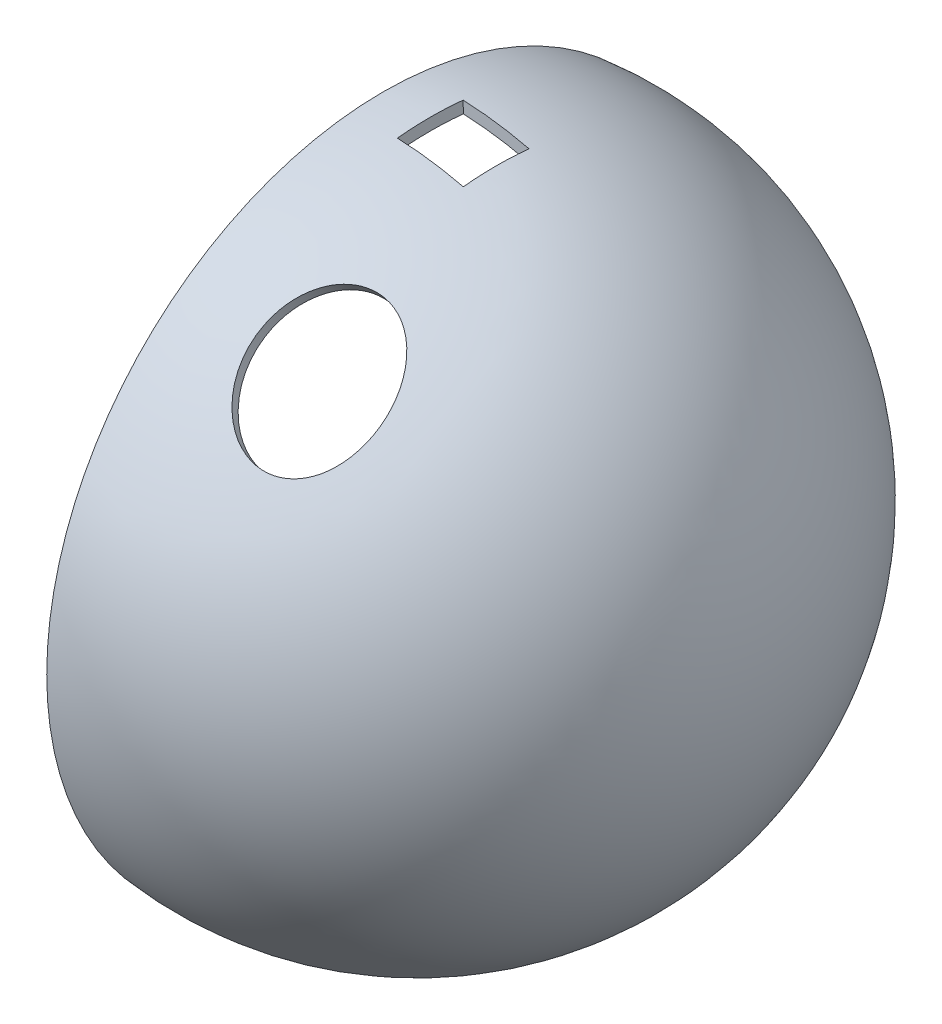
ISO-10303-21;
HEADER;
FILE_DESCRIPTION(('STEP AP214'),'2;1');
FILE_NAME('part.step','',(''),(''),'','','');
FILE_SCHEMA(('AUTOMOTIVE_DESIGN { 1 0 10303 214 1 1 1 1 }'));
ENDSEC;
DATA;
#1=APPLICATION_CONTEXT('core data for automotive mechanical design processes');
#2=APPLICATION_PROTOCOL_DEFINITION('international standard','automotive_design',2000,#1);
#3=PRODUCT_CONTEXT('',#1,'mechanical');
#4=PRODUCT('Part','Part','',(#3));
#5=PRODUCT_RELATED_PRODUCT_CATEGORY('part','',(#4));
#6=PRODUCT_DEFINITION_FORMATION('','',#4);
#7=PRODUCT_DEFINITION_CONTEXT('part definition',#1,'design');
#8=PRODUCT_DEFINITION('design','',#6,#7);
#9=PRODUCT_DEFINITION_SHAPE('','',#8);
#10=(LENGTH_UNIT() NAMED_UNIT(*) SI_UNIT(.MILLI.,.METRE.));
#11=(NAMED_UNIT(*) PLANE_ANGLE_UNIT() SI_UNIT($,.RADIAN.));
#12=(NAMED_UNIT(*) SI_UNIT($,.STERADIAN.) SOLID_ANGLE_UNIT());
#13=UNCERTAINTY_MEASURE_WITH_UNIT(LENGTH_MEASURE(1.E-05),#10,'distance_accuracy_value','');
#14=(GEOMETRIC_REPRESENTATION_CONTEXT(3) GLOBAL_UNCERTAINTY_ASSIGNED_CONTEXT((#13)) GLOBAL_UNIT_ASSIGNED_CONTEXT((#10,
#11,#12)) REPRESENTATION_CONTEXT('',''));
#15=CARTESIAN_POINT('',(0.,0.,0.));
#16=DIRECTION('',(0.,0.,1.));
#17=DIRECTION('',(1.,0.,0.));
#18=AXIS2_PLACEMENT_3D('',#15,#16,#17);
#19=CARTESIAN_POINT('',(-42.8018234911027,330.2,0.));
#20=DIRECTION('',(-1.,0.,0.));
#21=DIRECTION('',(0.,1.,0.));
#22=AXIS2_PLACEMENT_3D('',#19,#20,#21);
#23=SPHERICAL_SURFACE('',#22,228.6);
#24=CARTESIAN_POINT('',(-29.1388080691043,330.485631534092,0.));
#25=DIRECTION('',(0.999781552605937,0.0209008867960507,0.));
#26=DIRECTION('',(-0.0209008867960507,0.999781552605937,0.));
#27=AXIS2_PLACEMENT_3D('',#24,#25,#26);
#28=CIRCLE('',#27,228.191148873494);
#29=CARTESIAN_POINT('',(-24.3920860006964,103.428990079123,22.225));
#30=VERTEX_POINT('',#29);
#31=CARTESIAN_POINT('',(-24.3920860006964,103.428990079123,-22.225));
#32=VERTEX_POINT('',#31);
#33=EDGE_CURVE('E117',#30,#32,#28,.T.);
#34=ORIENTED_EDGE('',*,*,#33,.F.);
#35=CARTESIAN_POINT('',(-42.8018234911027,330.2,22.225));
#36=DIRECTION('',(0.,0.,-1.));
#37=DIRECTION('',(-1.,0.,0.));
#38=AXIS2_PLACEMENT_3D('',#35,#36,#37);
#39=CIRCLE('',#38,227.517052932302);
#40=CARTESIAN_POINT('',(19.8990376099266,111.493321107495,22.225));
#41=VERTEX_POINT('',#40);
#42=EDGE_CURVE('E104',#41,#30,#39,.T.);
#43=ORIENTED_EDGE('',*,*,#42,.F.);
#44=CARTESIAN_POINT('',(15.3014819442296,331.414675952177,0.));
#45=DIRECTION('',(-0.999781552605937,-0.0209008867960507,0.));
#46=DIRECTION('',(0.0209008867960507,-0.999781552605937,0.));
#47=AXIS2_PLACEMENT_3D('',#44,#45,#46);
#48=CIRCLE('',#47,221.089326879024);
#49=CARTESIAN_POINT('',(19.8990376099266,111.493321107495,-22.225));
#50=VERTEX_POINT('',#49);
#51=EDGE_CURVE('E253',#50,#41,#48,.T.);
#52=ORIENTED_EDGE('',*,*,#51,.F.);
#53=CARTESIAN_POINT('',(-42.8018234911027,330.2,-22.225));
#54=DIRECTION('',(0.,0.,1.));
#55=DIRECTION('',(1.,0.,0.));
#56=AXIS2_PLACEMENT_3D('',#53,#54,#55);
#57=CIRCLE('',#56,227.517052932302);
#58=EDGE_CURVE('E128',#32,#50,#57,.T.);
#59=ORIENTED_EDGE('',*,*,#58,.F.);
#60=EDGE_LOOP('',(#34,#43,#52,#59));
#61=FACE_BOUND('',#60,.T.);
#62=CARTESIAN_POINT('',(-65.6618234911027,330.2,0.));
#63=DIRECTION('',(-1.,0.,0.));
#64=DIRECTION('',(0.,0.,1.));
#65=AXIS2_PLACEMENT_3D('',#62,#63,#64);
#66=CIRCLE('',#65,227.454128122573);
#67=CARTESIAN_POINT('',(-65.6618234911027,330.2,227.454128122573));
#68=VERTEX_POINT('',#67);
#69=EDGE_CURVE('E279',#68,#68,#66,.T.);
#70=ORIENTED_EDGE('',*,*,#69,.F.);
#71=EDGE_LOOP('',(#70));
#72=FACE_BOUND('',#71,.T.);
#73=CARTESIAN_POINT('',(21.5548105527977,529.542640197618,91.5352142816228));
#74=CARTESIAN_POINT('',(20.9946202417218,529.666503588726,91.6593269395987));
#75=CARTESIAN_POINT('',(20.4355052571206,529.780707015209,91.798072908496));
#76=CARTESIAN_POINT('',(19.3212284247449,529.989511082851,92.1041942239797));
#77=CARTESIAN_POINT('',(18.7660683536586,530.084103391709,92.2715816847542));
#78=CARTESIAN_POINT('',(17.6617486770059,530.253477936403,92.6340505512017));
#79=CARTESIAN_POINT('',(17.1125896068616,530.328258418202,92.8291344066256));
#80=CARTESIAN_POINT('',(16.0212989977073,530.458075034406,93.2461773032342));
#81=CARTESIAN_POINT('',(15.4791786939356,530.51308263555,93.4681745694117));
#82=CARTESIAN_POINT('',(14.404423312614,530.603318035143,93.9375392029996));
#83=CARTESIAN_POINT('',(13.8717873415052,530.638547706603,94.1849041654104));
#84=CARTESIAN_POINT('',(12.8174491981342,530.689476204086,94.7036025083165));
#85=CARTESIAN_POINT('',(12.2957464256961,530.705176104968,94.9749345688553));
#86=CARTESIAN_POINT('',(11.0108913008253,530.720383868687,95.6791330498014));
#87=CARTESIAN_POINT('',(10.2551169585503,530.708138171573,96.1258389525206));
#88=CARTESIAN_POINT('',(8.77411521014697,530.642413454036,97.0643671961528));
#89=CARTESIAN_POINT('',(8.04888960930047,530.588932000375,97.5561921979423));
#90=CARTESIAN_POINT('',(6.63194937066435,530.442554703632,98.5796631091349));
#91=CARTESIAN_POINT('',(5.94021574999728,530.349681485756,99.1112860159401));
#92=CARTESIAN_POINT('',(4.59183419504404,530.126493398663,100.209616214898));
#93=CARTESIAN_POINT('',(3.93518172141706,529.99618338758,100.776318947295));
#94=CARTESIAN_POINT('',(2.42247702917198,529.645491036098,102.155067974572));
#95=CARTESIAN_POINT('',(1.58217648059559,529.409613440779,102.980531883407));
#96=CARTESIAN_POINT('',(-0.0282465899264927,528.876771883281,104.677410818609));
#97=CARTESIAN_POINT('',(-0.798411036548808,528.579844764637,105.548797895446));
#98=CARTESIAN_POINT('',(-2.26814890595555,527.929996351613,107.327840172517));
#99=CARTESIAN_POINT('',(-2.96778356930965,527.577124330957,108.235462936555));
#100=CARTESIAN_POINT('',(-4.29764967032336,526.819701770751,110.079596758121));
#101=CARTESIAN_POINT('',(-4.92786987008846,526.415142886158,111.016112461964));
#102=CARTESIAN_POINT('',(-6.11913923755177,525.558905141313,112.910019691168));
#103=CARTESIAN_POINT('',(-6.6802424403171,525.107263606509,113.867394211207));
#104=CARTESIAN_POINT('',(-7.73488070298338,524.160433610419,115.797466259074));
#105=CARTESIAN_POINT('',(-8.22842109932586,523.66524859349,116.770162569936));
#106=CARTESIAN_POINT('',(-9.14891571454892,522.635010470154,118.725061704198));
#107=CARTESIAN_POINT('',(-9.57590472415743,522.099978412038,119.707259273517));
#108=CARTESIAN_POINT('',(-10.3647954352752,520.992923985713,121.676998434174));
#109=CARTESIAN_POINT('',(-10.7266873785764,520.420896089181,122.664540803894));
#110=CARTESIAN_POINT('',(-11.5305582197867,518.985331361164,125.072467885205));
#111=CARTESIAN_POINT('',(-11.9384765213412,518.103599244226,126.493508602835));
#112=CARTESIAN_POINT('',(-12.6248189076984,516.277516593958,129.326819908158));
#113=CARTESIAN_POINT('',(-12.9032069045649,515.333148693544,130.73908794373));
#114=CARTESIAN_POINT('',(-13.3323560978456,513.389666951064,133.544044475549));
#115=CARTESIAN_POINT('',(-13.4831852443193,512.390582558649,134.936743007057));
#116=CARTESIAN_POINT('',(-13.6588098870947,510.344177136663,137.694137817934));
#117=CARTESIAN_POINT('',(-13.6836152044248,509.296859872297,139.058836271092));
#118=CARTESIAN_POINT('',(-13.607846187253,507.160681317219,141.751698384812));
#119=CARTESIAN_POINT('',(-13.5072748219729,506.071821010939,143.079862909825));
#120=CARTESIAN_POINT('',(-13.18063165111,503.859369413118,145.691192497397));
#121=CARTESIAN_POINT('',(-12.9545563253365,502.735777148233,146.974356296683));
#122=CARTESIAN_POINT('',(-12.3787522816756,500.471698713824,149.475236477571));
#123=CARTESIAN_POINT('',(-12.0301864526649,499.331464877016,150.693448375977));
#124=CARTESIAN_POINT('',(-11.2075939290852,497.031842569342,153.067962492728));
#125=CARTESIAN_POINT('',(-10.733575139438,495.872455309667,154.224268606304));
#126=CARTESIAN_POINT('',(-9.7030005282225,493.640551429924,156.371516498688));
#127=CARTESIAN_POINT('',(-9.15663315922622,492.568859127894,157.368205576618));
#128=CARTESIAN_POINT('',(-7.95501590162527,490.424593576083,159.292733747253));
#129=CARTESIAN_POINT('',(-7.29977967099581,489.352020453577,160.220581455251));
#130=CARTESIAN_POINT('',(-5.95442241809188,487.329243444605,161.902977984218));
#131=CARTESIAN_POINT('',(-5.27548461363342,486.378194630371,162.665454180059));
#132=CARTESIAN_POINT('',(-3.82803094687366,484.490458276333,164.120080161623));
#133=CARTESIAN_POINT('',(-3.0595275748188,483.553768754638,164.81223972812));
#134=CARTESIAN_POINT('',(-1.52780873253299,481.812526261579,166.040874162408));
#135=CARTESIAN_POINT('',(-0.774562439680618,481.005369563256,166.586086627282));
#136=CARTESIAN_POINT('',(0.802168191068511,479.416748808581,167.608253604799));
#137=CARTESIAN_POINT('',(1.62564130798861,478.635280675203,168.085218989602));
#138=CARTESIAN_POINT('',(3.24277822357058,477.194771406073,168.912925763024));
#139=CARTESIAN_POINT('',(4.0289203500727,476.532007448135,169.271881107052));
#140=CARTESIAN_POINT('',(5.65387555440074,475.239913100232,169.925314810061));
#141=CARTESIAN_POINT('',(6.49268397141448,474.61057976083,170.219798864243));
#142=CARTESIAN_POINT('',(8.13114685750253,473.455603360276,170.711971916634));
#143=CARTESIAN_POINT('',(8.92592117943557,472.925959538333,170.916510426621));
#144=CARTESIAN_POINT('',(10.5525063814183,471.905465130558,171.265257455205));
#145=CARTESIAN_POINT('',(11.3843047568827,471.414601600098,171.409486174443));
#146=CARTESIAN_POINT('',(13.0103268642653,470.516624163651,171.624614594442));
#147=CARTESIAN_POINT('',(13.801888437653,470.105939584906,171.70063173518));
#148=CARTESIAN_POINT('',(15.0072215770065,469.521459729642,171.772540012722));
#149=CARTESIAN_POINT('',(15.4121884797294,469.331810853086,171.789487954491));
#150=CARTESIAN_POINT('',(16.2275653425286,468.963587665954,171.809074978715));
#151=CARTESIAN_POINT('',(16.6379763846731,468.785015598267,171.811711172544));
#152=CARTESIAN_POINT('',(17.8396684046613,468.282144476339,171.798201072582));
#153=CARTESIAN_POINT('',(18.637353147722,467.973269264142,171.762758671345));
#154=CARTESIAN_POINT('',(20.2451188805164,467.401637520903,171.637658935632));
#155=CARTESIAN_POINT('',(21.0552034758264,467.138894692041,171.547985528564));
#156=CARTESIAN_POINT('',(22.6825227134219,466.662379560437,171.314074815565));
#157=CARTESIAN_POINT('',(23.4997617227594,466.448639699942,171.16980152852));
#158=CARTESIAN_POINT('',(25.1346916013557,466.07256422288,170.82730781866));
#159=CARTESIAN_POINT('',(25.9523824239694,465.910224036788,170.629092194332));
#160=CARTESIAN_POINT('',(27.5706846846263,465.640083549721,170.183331676805));
#161=CARTESIAN_POINT('',(28.3713750747833,465.531552441033,169.936515220695));
#162=CARTESIAN_POINT('',(29.9614454187845,465.365936733045,169.394063538758));
#163=CARTESIAN_POINT('',(30.7508252196847,465.30885282878,169.09842765346));
#164=CARTESIAN_POINT('',(32.3129146104614,465.245496735437,168.46116043423));
#165=CARTESIAN_POINT('',(33.0856227179647,465.239229046294,168.11952502962));
#166=CARTESIAN_POINT('',(34.6094722193833,465.276063365791,167.393611123152));
#167=CARTESIAN_POINT('',(35.3606134933848,465.319165648879,167.009332384251));
#168=CARTESIAN_POINT('',(36.8455893469166,465.453375165867,166.197181003512));
#169=CARTESIAN_POINT('',(37.5791313426492,465.545020866666,165.768863695197));
#170=CARTESIAN_POINT('',(39.0165204869468,465.773929174886,164.876187641378));
#171=CARTESIAN_POINT('',(39.7203663404911,465.911193769391,164.411827326575));
#172=CARTESIAN_POINT('',(41.0954624591711,466.228248467451,163.451061109121));
#173=CARTESIAN_POINT('',(41.7667227826307,466.408025346644,162.954665206673));
#174=CARTESIAN_POINT('',(43.0748254394758,466.80687524626,161.933477769051));
#175=CARTESIAN_POINT('',(43.7116713511096,467.025944171012,161.408689197412));
#176=CARTESIAN_POINT('',(45.2002910125453,467.596154991784,160.116583871252));
#177=CARTESIAN_POINT('',(46.0347951782089,467.964875238661,159.337034751909));
#178=CARTESIAN_POINT('',(47.6311679117266,468.764661103693,157.737458465733));
#179=CARTESIAN_POINT('',(48.3930494417019,469.195715561366,156.917438562172));
#180=CARTESIAN_POINT('',(49.8503735686587,470.116217774277,155.236735539446));
#181=CARTESIAN_POINT('',(50.5451666096637,470.606149754536,154.375756156152));
#182=CARTESIAN_POINT('',(51.8612390319321,471.633999676336,152.626182407178));
#183=CARTESIAN_POINT('',(52.4824857444384,472.171938757605,151.737575989396));
#184=CARTESIAN_POINT('',(53.6527929169591,473.289584497154,149.937667202003));
#185=CARTESIAN_POINT('',(54.2017704803519,473.869337959501,149.026340170879));
#186=CARTESIAN_POINT('',(55.2278699181016,475.064013776238,147.18703182583));
#187=CARTESIAN_POINT('',(55.7050106576108,475.678926838592,146.259054956233));
#188=CARTESIAN_POINT('',(56.6569085174574,477.035670307764,144.246857799292));
#189=CARTESIAN_POINT('',(57.1200636178336,477.78249644,143.160513862202));
#190=CARTESIAN_POINT('',(57.9545694668635,479.308640523629,140.977546168879));
#191=CARTESIAN_POINT('',(58.3260175385219,480.087922995383,139.880934603448));
#192=CARTESIAN_POINT('',(58.9796643206205,481.67386292491,137.681163414463));
#193=CARTESIAN_POINT('',(59.2618705288428,482.480518076619,136.578004348943));
#194=CARTESIAN_POINT('',(59.7387495369816,484.116445417751,134.369137087808));
#195=CARTESIAN_POINT('',(59.9333985585329,484.945723686277,133.263428281592));
#196=CARTESIAN_POINT('',(60.2362556292249,486.622003727707,131.05424789963));
#197=CARTESIAN_POINT('',(60.3444927093304,487.468999450033,129.950775696854));
#198=CARTESIAN_POINT('',(60.4754939111179,489.177021744536,127.749782255371));
#199=CARTESIAN_POINT('',(60.4982640266183,490.038047328541,126.652260604742));
#200=CARTESIAN_POINT('',(60.4588112413192,491.77064503855,124.467154204978));
#201=CARTESIAN_POINT('',(60.3965899961868,492.642216958779,123.379569262686));
#202=CARTESIAN_POINT('',(60.1872152971887,494.392678134437,121.218508880927));
#203=CARTESIAN_POINT('',(60.0400603906052,495.271567514772,120.145033683115));
#204=CARTESIAN_POINT('',(59.6604557933947,497.033655857036,118.016599006031));
#205=CARTESIAN_POINT('',(59.4279955323465,497.916855339652,116.961641838362));
#206=CARTESIAN_POINT('',(58.8770606083453,499.684404787534,114.875350376806));
#207=CARTESIAN_POINT('',(58.5585858212166,500.568754754457,113.844016117026));
#208=CARTESIAN_POINT('',(57.8344175259651,502.335798497413,111.810197798105));
#209=CARTESIAN_POINT('',(57.428693416374,503.218491582465,110.807724001603));
#210=CARTESIAN_POINT('',(56.5287112442733,504.978587339066,108.838397204421));
#211=CARTESIAN_POINT('',(56.0344543139379,505.855990078121,107.871543748413));
#212=CARTESIAN_POINT('',(54.9554733627425,507.602383059847,105.980254375186));
#213=CARTESIAN_POINT('',(54.370694611958,508.471367873012,105.055844560926));
#214=CARTESIAN_POINT('',(53.1091251886683,510.196283252552,103.258593277791));
#215=CARTESIAN_POINT('',(52.432326423141,511.052212663351,102.385756354371));
#216=CARTESIAN_POINT('',(51.0226952598422,512.702141237436,100.745429063427));
#217=CARTESIAN_POINT('',(50.2945666516693,513.497054844173,99.9748255348134));
#218=CARTESIAN_POINT('',(48.753758980783,515.065134813965,98.4995836893178));
#219=CARTESIAN_POINT('',(47.9411274338128,515.838313091323,97.7949087199862));
#220=CARTESIAN_POINT('',(46.34978696498,517.25177748136,96.5550762549574));
#221=CARTESIAN_POINT('',(45.5819947389088,517.895626424317,96.0099614624017));
#222=CARTESIAN_POINT('',(43.983131073143,519.159280518289,94.9843371808277));
#223=CARTESIAN_POINT('',(43.1519710809411,519.779050125438,94.5039207949349));
#224=CARTESIAN_POINT('',(41.7760661193181,520.744830490302,93.7959198203131));
#225=CARTESIAN_POINT('',(41.2504735129944,521.100751273673,93.5443244236502));
#226=CARTESIAN_POINT('',(40.178381231646,521.800472661929,93.0697078852254));
#227=CARTESIAN_POINT('',(39.6318754183986,522.144269650582,92.8466952176026));
#228=CARTESIAN_POINT('',(38.5189833480514,522.81828569559,92.4313198643039));
#229=CARTESIAN_POINT('',(37.9525924667444,523.148501554409,92.2389643662384));
#230=CARTESIAN_POINT('',(36.8021410052326,523.793323279883,91.8872083334245));
#231=CARTESIAN_POINT('',(36.2181077669515,524.107951488312,91.7277595301277));
#232=CARTESIAN_POINT('',(35.0332655797849,524.720514003242,91.4433893823302));
#233=CARTESIAN_POINT('',(34.4324601412235,525.018451764286,91.3184608717058));
#234=CARTESIAN_POINT('',(33.2161665408084,525.595973554664,91.1049008187498));
#235=CARTESIAN_POINT('',(32.6006878437507,525.875569000907,91.0162465145756));
#236=CARTESIAN_POINT('',(31.5659440405881,526.324377594987,90.9001016480395));
#237=CARTESIAN_POINT('',(31.1502231452563,526.499118659956,90.86206888083));
#238=CARTESIAN_POINT('',(30.31392181235,526.839434538446,90.8030020170222));
#239=CARTESIAN_POINT('',(29.8933423090214,527.005011079855,90.7819647058434));
#240=CARTESIAN_POINT('',(29.048318398089,527.326488501272,90.7571981842697));
#241=CARTESIAN_POINT('',(28.6238767605178,527.482395772026,90.753457419094));
#242=CARTESIAN_POINT('',(27.7716400518744,527.78426121776,90.763485810313));
#243=CARTESIAN_POINT('',(27.3438447578574,527.930218724936,90.7772561407927));
#244=CARTESIAN_POINT('',(26.470916454704,528.216676803714,90.8232460090248));
#245=CARTESIAN_POINT('',(26.0256963997444,528.356812944672,90.8560884001249));
#246=CARTESIAN_POINT('',(25.1336332681576,528.625633015166,90.9407536360276));
#247=CARTESIAN_POINT('',(24.686790280974,528.75431756615,90.9925754500851));
#248=CARTESIAN_POINT('',(23.792156828129,528.999997923025,91.1152111049267));
#249=CARTESIAN_POINT('',(23.3443659220837,529.116985625108,91.1860379893527));
#250=CARTESIAN_POINT('',(22.4490921239615,529.338912221663,91.3465426082458));
#251=CARTESIAN_POINT('',(22.0016093092715,529.443848754736,91.4362240275075));
#252=CARTESIAN_POINT('',(21.5548105527977,529.542640197618,91.5352142816228));
#253=B_SPLINE_CURVE_WITH_KNOTS('',3,(#73,#74,#75,#76,#77,#78,#79,#80,#81,#82,#83,#84,#85,#86,
#87,#88,#89,#90,#91,#92,#93,#94,#95,#96,#97,#98,#99,#100,#101,#102,#103,#104,#105,#106,#107,
#108,#109,#110,#111,#112,#113,#114,#115,#116,#117,#118,#119,#120,#121,#122,#123,#124,#125,#126,
#127,#128,#129,#130,#131,#132,#133,#134,#135,#136,#137,#138,#139,#140,#141,#142,#143,#144,#145,
#146,#147,#148,#149,#150,#151,#152,#153,#154,#155,#156,#157,#158,#159,#160,#161,#162,#163,#164,
#165,#166,#167,#168,#169,#170,#171,#172,#173,#174,#175,#176,#177,#178,#179,#180,#181,#182,#183,
#184,#185,#186,#187,#188,#189,#190,#191,#192,#193,#194,#195,#196,#197,#198,#199,#200,#201,#202,
#203,#204,#205,#206,#207,#208,#209,#210,#211,#212,#213,#214,#215,#216,#217,#218,#219,#220,#221,
#222,#223,#224,#225,#226,#227,#228,#229,#230,#231,#232,#233,#234,#235,#236,#237,#238,#239,#240,
#241,#242,#243,#244,#245,#246,#247,#248,#249,#250,#251,#252),.UNSPECIFIED.,.T.,.F.,(4,2,2,2,2,2,
2,2,2,2,2,2,2,2,2,2,2,2,2,2,2,2,2,2,2,2,2,2,2,2,2,2,2,2,2,2,2,2,2,2,2,2,2,2,2,2,2,2,2,2,2,2,2,2,
2,2,2,2,2,2,2,2,2,2,2,2,2,2,2,2,2,2,2,2,2,2,2,2,2,2,2,2,2,2,2,2,2,2,2,4),(0.,1.76076665407313,
3.52227989020994,5.28394902968612,7.04815023621904,8.81218434095281,10.5761213543292,
13.2071735635721,15.838381037684,18.4680792833493,21.0974364297534,24.6962857652917,
28.2929695283897,31.8865029165637,35.4806172294011,39.0719036172082,42.6629061837518,
46.2520251579757,49.8416817022913,54.9992345291814,60.1582234227398,65.314462410646,
70.4702995670359,75.6260146230993,80.78187429625,85.8900522927707,90.9979084942682,
95.67952304994,100.360550723723,104.542080108255,108.723027059381,112.413181456552,
116.102747334534,119.366644520861,122.630253267878,125.557366567459,128.483498649507,
131.165294803286,132.507430135661,133.84983634925,136.41502826751,138.980980811542,
141.548627261411,144.116045378648,146.647567501483,149.179123823805,151.710904320935,
154.242698892309,156.803184284273,159.363781221416,161.923582675048,164.483117458457,
168.0780437886,171.672327268642,175.298505536237,178.926288530452,182.558197187568,
186.189150394983,190.377299407883,194.560984505337,198.744318011086,202.928786921809,
207.111849425638,211.294618564819,215.477306223075,219.660065424749,223.843343098734,
228.026626811978,232.21138015295,236.396079982342,240.5833198551,244.770928227814,
248.742108961744,252.711068665311,256.129769778678,259.553339112227,261.600880870033,
263.64902828075,265.697655177958,267.743255386858,269.788430626708,271.832320556186,
273.189586710145,274.546596085846,275.902698794199,277.258892431403,278.662087580058,
280.065206534514,281.469290957697,282.873650040541),.UNSPECIFIED.);
#254=CARTESIAN_POINT('',(21.5548105527977,529.542640197618,91.5352142816228));
#255=VERTEX_POINT('',#254);
#256=EDGE_CURVE('E132',#255,#255,#253,.T.);
#257=ORIENTED_EDGE('',*,*,#256,.F.);
#258=EDGE_LOOP('',(#257));
#259=FACE_BOUND('',#258,.T.);
#260=CARTESIAN_POINT('',(-33.8855301375123,557.542272989061,-22.225));
#261=VERTEX_POINT('',#260);
#262=CARTESIAN_POINT('',(-33.8855301375123,557.542272989061,22.225));
#263=VERTEX_POINT('',#262);
#264=EDGE_CURVE('E126',#261,#263,#28,.T.);
#265=ORIENTED_EDGE('',*,*,#264,.F.);
#266=CARTESIAN_POINT('',(10.7039262785326,551.336030796859,-22.225));
#267=VERTEX_POINT('',#266);
#268=EDGE_CURVE('E134',#267,#261,#57,.T.);
#269=ORIENTED_EDGE('',*,*,#268,.F.);
#270=CARTESIAN_POINT('',(10.7039262785326,551.336030796859,22.225));
#271=VERTEX_POINT('',#270);
#272=EDGE_CURVE('E260',#271,#267,#48,.T.);
#273=ORIENTED_EDGE('',*,*,#272,.F.);
#274=EDGE_CURVE('E115',#263,#271,#39,.T.);
#275=ORIENTED_EDGE('',*,*,#274,.F.);
#276=EDGE_LOOP('',(#265,#269,#273,#275));
#277=FACE_BOUND('',#276,.T.);
#278=ADVANCED_FACE('F41',(#61,#72,#259,#277),#23,.T.);
#279=CARTESIAN_POINT('',(-42.8018234911027,330.2,0.));
#280=DIRECTION('',(-1.,0.,0.));
#281=DIRECTION('',(0.,1.,0.));
#282=AXIS2_PLACEMENT_3D('',#279,#280,#281);
#283=SPHERICAL_SURFACE('',#282,220.6625);
#284=CARTESIAN_POINT('',(-65.6618234911028,330.2,0.));
#285=DIRECTION('',(-1.,0.,0.));
#286=DIRECTION('',(0.,0.,1.));
#287=AXIS2_PLACEMENT_3D('',#284,#285,#286);
#288=CIRCLE('',#287,219.475190639512);
#289=CARTESIAN_POINT('',(-65.6618234911028,330.2,219.475190639512));
#290=VERTEX_POINT('',#289);
#291=EDGE_CURVE('E141',#290,#290,#288,.T.);
#292=ORIENTED_EDGE('',*,*,#291,.T.);
#293=EDGE_LOOP('',(#292));
#294=FACE_BOUND('',#293,.T.);
#295=CARTESIAN_POINT('',(20.6233416279181,523.149935980794,86.2525915024144));
#296=CARTESIAN_POINT('',(20.0629375721465,523.277346032766,86.3796597296597));
#297=CARTESIAN_POINT('',(19.5036860369076,523.395110781448,86.5214307966108));
#298=CARTESIAN_POINT('',(18.3891179428946,523.611099440231,86.8337550018208));
#299=CARTESIAN_POINT('',(17.8338037369788,523.709312483217,87.0043240496161));
#300=CARTESIAN_POINT('',(16.7292347497666,523.885956037858,87.3732758982888));
#301=CARTESIAN_POINT('',(16.1799807289156,523.964384093249,87.5716621478607));
#302=CARTESIAN_POINT('',(15.0882259742785,524.101557633501,87.9955417023308));
#303=CARTESIAN_POINT('',(14.545741499377,524.160262203288,88.22109005341));
#304=CARTESIAN_POINT('',(13.4703507330857,524.257866744313,88.6976542723672));
#305=CARTESIAN_POINT('',(12.9374432151518,524.296769269337,88.9486668512204));
#306=CARTESIAN_POINT('',(11.8826343172056,524.355009959672,89.4747414080309));
#307=CARTESIAN_POINT('',(11.3607322341564,524.37434937842,89.7498018439781));
#308=CARTESIAN_POINT('',(10.0756716006652,524.398567041099,90.4632518868872));
#309=CARTESIAN_POINT('',(9.31992104085943,524.391677027011,90.9155068545776));
#310=CARTESIAN_POINT('',(7.83905656084201,524.336548314726,91.8652033328637));
#311=CARTESIAN_POINT('',(7.1139446920289,524.288306852452,92.3626478621026));
#312=CARTESIAN_POINT('',(5.69740460478247,524.152260622896,93.3973104884119));
#313=CARTESIAN_POINT('',(5.00595274417324,524.064484081926,93.9344999810391));
#314=CARTESIAN_POINT('',(3.65818251536718,523.851305143264,95.0439484128196));
#315=CARTESIAN_POINT('',(3.00185953203645,523.725907702469,95.616202723963));
#316=CARTESIAN_POINT('',(1.48984915401383,523.386564366649,97.0081761712106));
#317=CARTESIAN_POINT('',(0.649938011448027,523.157017999127,97.8413057547118));
#318=CARTESIAN_POINT('',(-0.95966632433594,522.636313276681,99.5534339699723));
#319=CARTESIAN_POINT('',(-1.72939911333224,522.345189976201,100.432406290843));
#320=CARTESIAN_POINT('',(-3.19821219868519,521.706356869733,102.226478284976));
#321=CARTESIAN_POINT('',(-3.8973527902415,521.358696028559,103.141546182514));
#322=CARTESIAN_POINT('',(-5.22611150616035,520.611080646667,105.000335257591));
#323=CARTESIAN_POINT('',(-5.85572164285706,520.211120109258,105.944059711353));
#324=CARTESIAN_POINT('',(-7.0456475433007,519.363420625179,107.852109777841));
#325=CARTESIAN_POINT('',(-7.60602099449204,518.915722040926,108.816417444272));
#326=CARTESIAN_POINT('',(-8.65914845965901,517.976034347049,110.760194541316));
#327=CARTESIAN_POINT('',(-9.15189673839984,517.484041486717,111.739665250064));
#328=CARTESIAN_POINT('',(-10.2359061619152,516.275163717253,114.061811312881));
#329=CARTESIAN_POINT('',(-10.7990490428674,515.540940281529,115.408670618653));
#330=CARTESIAN_POINT('',(-11.8053698863102,514.004697244555,118.108676030103));
#331=CARTESIAN_POINT('',(-12.2485148130199,513.202659053294,119.461823762926));
#332=CARTESIAN_POINT('',(-13.0169091285748,511.538513287266,122.163018926526));
#333=CARTESIAN_POINT('',(-13.342249033154,510.676452440883,123.511069482226));
#334=CARTESIAN_POINT('',(-13.877487970198,508.898195913177,126.194049929264));
#335=CARTESIAN_POINT('',(-14.087395879466,507.982004400543,127.528980821758));
#336=CARTESIAN_POINT('',(-14.3932429016989,506.101675919655,130.17738664788));
#337=CARTESIAN_POINT('',(-14.4892112661971,505.137551323443,131.490867003034));
#338=CARTESIAN_POINT('',(-14.5681643031028,503.166939772041,134.089139567288));
#339=CARTESIAN_POINT('',(-14.5511471379828,502.160452128149,135.373931309473));
#340=CARTESIAN_POINT('',(-14.4044274276808,500.110932897286,137.907439473976));
#341=CARTESIAN_POINT('',(-14.2747248399859,499.067901296528,139.156155882684));
#342=CARTESIAN_POINT('',(-13.9023566052983,496.951272342152,141.610144591079));
#343=CARTESIAN_POINT('',(-13.6596907409082,495.877674929714,142.815416807153));
#344=CARTESIAN_POINT('',(-13.0604729659515,493.705949488648,145.175264357045));
#345=CARTESIAN_POINT('',(-12.7038855458054,492.607813910818,146.329823755769));
#346=CARTESIAN_POINT('',(-11.8754914139298,490.394318555854,148.579752591266));
#347=CARTESIAN_POINT('',(-11.4036860130817,489.27895897482,149.675122701287));
#348=CARTESIAN_POINT('',(-10.3691656336849,487.094015761801,151.745631101954));
#349=CARTESIAN_POINT('',(-9.81205437111326,486.024874669318,152.724032287344));
#350=CARTESIAN_POINT('',(-8.59032066733962,483.886124697932,154.610778537946));
#351=CARTESIAN_POINT('',(-7.92571198309721,482.816515896328,155.519132545494));
#352=CARTESIAN_POINT('',(-6.56549068671841,480.801992154792,157.161760083902));
#353=CARTESIAN_POINT('',(-5.88111245139691,479.856168190639,157.904221804637));
#354=CARTESIAN_POINT('',(-4.42443489480797,477.979163857295,159.318373648195));
#355=CARTESIAN_POINT('',(-3.65214153730219,477.047982499688,159.990068565572));
#356=CARTESIAN_POINT('',(-2.11403859042527,475.316313580398,161.180618205352));
#357=CARTESIAN_POINT('',(-1.35790226783375,474.51321204331,161.708163460009));
#358=CARTESIAN_POINT('',(0.222957597538658,472.933271328758,162.694534338597));
#359=CARTESIAN_POINT('',(1.04764974264914,472.156420355671,163.153391154182));
#360=CARTESIAN_POINT('',(2.66656643125819,470.724032515358,163.947339912447));
#361=CARTESIAN_POINT('',(3.45348047025671,470.064785296879,164.290585682785));
#362=CARTESIAN_POINT('',(4.67264479114174,469.100993412985,164.75715757224));
#363=CARTESIAN_POINT('',(5.08574936442238,468.783732521962,164.904703625471));
#364=CARTESIAN_POINT('',(5.92459807250872,468.158493192632,165.18299548527));
#365=CARTESIAN_POINT('',(6.35034486122588,467.850516731094,165.313737733172));
#366=CARTESIAN_POINT('',(7.56922326920643,466.995780362228,165.658033030634));
#367=CARTESIAN_POINT('',(8.37661838242926,466.460880718044,165.851293648753));
#368=CARTESIAN_POINT('',(10.0288883633886,465.431198392911,166.175666922386));
#369=CARTESIAN_POINT('',(10.8737728950449,464.936426149934,166.306763450433));
#370=CARTESIAN_POINT('',(12.5971172779404,463.99308692622,166.503094540793));
#371=CARTESIAN_POINT('',(13.4755895232211,463.544537231913,166.568304542387));
#372=CARTESIAN_POINT('',(14.8135414545486,462.911411217717,166.614327084856));
#373=CARTESIAN_POINT('',(15.2629443467647,462.706967563159,166.621033976062));
#374=CARTESIAN_POINT('',(16.1677358348709,462.312012185042,166.616895208701));
#375=CARTESIAN_POINT('',(16.6231238829793,462.121499196833,166.606051145513));
#376=CARTESIAN_POINT('',(17.669618970873,461.702863465053,166.56092844281));
#377=CARTESIAN_POINT('',(18.2623986626182,461.479506883379,166.520849201132));
#378=CARTESIAN_POINT('',(19.454267482903,461.058371814142,166.41095845198));
#379=CARTESIAN_POINT('',(20.0533567565061,460.860593916054,166.341146259454));
#380=CARTESIAN_POINT('',(21.2555606018173,460.491825949354,166.171697408256));
#381=CARTESIAN_POINT('',(21.8586751512456,460.320835732601,166.072060914528));
#382=CARTESIAN_POINT('',(23.0660941718707,460.006738603615,165.843205775162));
#383=CARTESIAN_POINT('',(23.6703975372489,459.863612565728,165.714007553798));
#384=CARTESIAN_POINT('',(24.8781411172488,459.605820645341,165.426409021822));
#385=CARTESIAN_POINT('',(25.48158132484,459.491154993356,165.268008474703));
#386=CARTESIAN_POINT('',(26.6849804198703,459.290739469691,164.922727049974));
#387=CARTESIAN_POINT('',(27.2849397602394,459.204985749121,164.735849968105));
#388=CARTESIAN_POINT('',(28.6740951670007,459.039263847648,164.268934755871));
#389=CARTESIAN_POINT('',(29.4611235286203,458.970325111288,163.978400558893));
#390=CARTESIAN_POINT('',(31.0193963770224,458.883157054709,163.351519140309));
#391=CARTESIAN_POINT('',(31.7906423199933,458.864923035013,163.015176167441));
#392=CARTESIAN_POINT('',(33.312761169581,458.877859858093,162.299798366365));
#393=CARTESIAN_POINT('',(34.0636307376393,458.909038747789,161.920756593973));
#394=CARTESIAN_POINT('',(35.5406891715965,459.018850757345,161.123557340685));
#395=CARTESIAN_POINT('',(36.2668769862883,459.097485895719,160.705398196601));
#396=CARTESIAN_POINT('',(37.717523028728,459.303468946291,159.817485776849));
#397=CARTESIAN_POINT('',(38.4409195368162,459.43251434065,159.346394650513));
#398=CARTESIAN_POINT('',(39.8544715065446,459.735786007436,158.370189263954));
#399=CARTESIAN_POINT('',(40.5446251569222,459.910014738417,157.865073153442));
#400=CARTESIAN_POINT('',(41.8893772074329,460.300225917827,156.824842282783));
#401=CARTESIAN_POINT('',(42.5439805659031,460.516202524261,156.289731727344));
#402=CARTESIAN_POINT('',(43.8161193822241,460.986415485049,155.193250529028));
#403=CARTESIAN_POINT('',(44.4336587146406,461.240647830481,154.631882641972));
#404=CARTESIAN_POINT('',(45.8961621160351,461.904436253621,153.232275841545));
#405=CARTESIAN_POINT('',(46.7206905752053,462.332909368322,152.381546323438));
#406=CARTESIAN_POINT('',(48.289004141104,463.252498662378,150.642010174722));
#407=CARTESIAN_POINT('',(49.032835837538,463.743578336181,149.753225932616));
#408=CARTESIAN_POINT('',(50.4399108406035,464.779336758819,147.945592569307));
#409=CARTESIAN_POINT('',(51.1032336773392,465.323961634465,147.026774275202));
#410=CARTESIAN_POINT('',(52.351180615446,466.459532705205,145.164608369844));
#411=CARTESIAN_POINT('',(52.93579281784,467.050485882602,144.221257075508));
#412=CARTESIAN_POINT('',(54.0271538626343,468.271343911162,142.316437013818));
#413=CARTESIAN_POINT('',(54.5339667398983,468.901216123468,141.354983885471));
#414=CARTESIAN_POINT('',(55.471828076237,470.194399366177,139.417977439477));
#415=CARTESIAN_POINT('',(55.9028824195115,470.85770779442,138.442425223289));
#416=CARTESIAN_POINT('',(56.6906257203998,472.21233881867,136.481724452246));
#417=CARTESIAN_POINT('',(57.0473540526278,472.903646348967,135.496581269284));
#418=CARTESIAN_POINT('',(57.6882022322789,474.310211825192,133.519719386888));
#419=CARTESIAN_POINT('',(57.9723109681419,475.025473417429,132.527999704969));
#420=CARTESIAN_POINT('',(58.5840707332038,476.811577638524,130.081709889548));
#421=CARTESIAN_POINT('',(58.8710945299061,477.893887469147,128.625191761978));
#422=CARTESIAN_POINT('',(59.2955150262231,480.090952459785,125.714544065285));
#423=CARTESIAN_POINT('',(59.432868905416,481.205716811398,124.260415298504));
#424=CARTESIAN_POINT('',(59.5597501540867,483.458206243982,121.364478949909));
#425=CARTESIAN_POINT('',(59.5493365543569,484.595921974865,119.922666678161));
#426=CARTESIAN_POINT('',(59.3815390423051,486.88686202145,117.060214981149));
#427=CARTESIAN_POINT('',(59.2241653345929,488.040085254862,115.639574092747));
#428=CARTESIAN_POINT('',(58.7664727714332,490.332548968761,112.856657485783));
#429=CARTESIAN_POINT('',(58.4689811833025,491.471627738354,111.493784267957));
#430=CARTESIAN_POINT('',(57.7306992765676,493.751382310229,108.808700514647));
#431=CARTESIAN_POINT('',(57.2899197555362,494.892057985728,107.486486923441));
#432=CARTESIAN_POINT('',(56.310456162915,497.062275498438,105.015900762919));
#433=CARTESIAN_POINT('',(55.784706447289,498.092277561959,103.86280359903));
#434=CARTESIAN_POINT('',(54.6108824103529,500.142671433375,101.611288229141));
#435=CARTESIAN_POINT('',(53.9628144476186,501.16306373793,100.512867184614));
#436=CARTESIAN_POINT('',(52.6295366383141,503.062798352967,98.5154496500577));
#437=CARTESIAN_POINT('',(51.9587861265077,503.944003912643,97.608573182661));
#438=CARTESIAN_POINT('',(50.5199195154844,505.688719909961,95.8579326245705));
#439=CARTESIAN_POINT('',(49.7518566036574,506.552239716723,95.0141344551813));
#440=CARTESIAN_POINT('',(48.2262434066599,508.142046933961,93.5093190150249));
#441=CARTESIAN_POINT('',(47.4809809853683,508.871263712874,92.8389394642026));
#442=CARTESIAN_POINT('',(45.9151519339681,510.308317790798,91.5629214727069));
#443=CARTESIAN_POINT('',(45.0944925501601,511.016127293055,90.9573648140958));
#444=CARTESIAN_POINT('',(43.477045553531,512.324828392567,89.8868854532468));
#445=CARTESIAN_POINT('',(42.6881027798394,512.928742830868,89.4138020814268));
#446=CARTESIAN_POINT('',(41.0537192679757,514.110031314842,88.5352834362293));
#447=CARTESIAN_POINT('',(40.2082618565435,514.687397442532,88.1298682511567));
#448=CARTESIAN_POINT('',(38.9005882503934,515.529081458644,87.5790456793284));
#449=CARTESIAN_POINT('',(38.4580678219382,515.805609370075,87.4049730978367));
#450=CARTESIAN_POINT('',(37.5603312973031,516.349864048206,87.0769394964294));
#451=CARTESIAN_POINT('',(37.1051160763824,516.617591418912,86.9229770941306));
#452=CARTESIAN_POINT('',(36.1828453425384,517.143360997358,86.636268167871));
#453=CARTESIAN_POINT('',(35.7157951300507,517.401407416728,86.5035123342924));
#454=CARTESIAN_POINT('',(34.7703467504233,517.907203186878,86.2601040122482));
#455=CARTESIAN_POINT('',(34.2919456903311,518.154949867342,86.1494572278347));
#456=CARTESIAN_POINT('',(33.0522310018243,518.775764271418,85.8954089889402));
#457=CARTESIAN_POINT('',(32.2833798090519,519.140797313962,85.7686755533797));
#458=CARTESIAN_POINT('',(30.7246172851594,519.840363421872,85.5749546352547));
#459=CARTESIAN_POINT('',(29.9347100592988,520.174902377214,85.5079555928614));
#460=CARTESIAN_POINT('',(28.7387545986737,520.651204638905,85.4541245159829));
#461=CARTESIAN_POINT('',(28.3386324904031,520.805588724368,85.4439465336373));
#462=CARTESIAN_POINT('',(27.5351005526872,521.105654082929,85.439283122884));
#463=CARTESIAN_POINT('',(27.1316913301278,521.251336922903,85.4447948604001));
#464=CARTESIAN_POINT('',(26.3223960132159,521.533631674118,85.4716699424323));
#465=CARTESIAN_POINT('',(25.9165108431804,521.67024676831,85.4930276922941));
#466=CARTESIAN_POINT('',(25.1028780264752,521.934151099199,85.5516774424295));
#467=CARTESIAN_POINT('',(24.6951303858686,522.061440366232,85.5889693908676));
#468=CARTESIAN_POINT('',(23.6770416049045,522.366854390986,85.7018623461409));
#469=CARTESIAN_POINT('',(23.0659830368766,522.539081612277,85.7872863960681));
#470=CARTESIAN_POINT('',(21.8439422339432,522.861323957741,85.9935355652009));
#471=CARTESIAN_POINT('',(21.2329600127833,523.011336858788,86.1143642239655));
#472=CARTESIAN_POINT('',(20.6233416279181,523.149935980794,86.2525915024144));
#473=B_SPLINE_CURVE_WITH_KNOTS('',3,(#295,#296,#297,#298,#299,#300,#301,#302,#303,#304,#305,
#306,#307,#308,#309,#310,#311,#312,#313,#314,#315,#316,#317,#318,#319,#320,#321,#322,#323,#324,
#325,#326,#327,#328,#329,#330,#331,#332,#333,#334,#335,#336,#337,#338,#339,#340,#341,#342,#343,
#344,#345,#346,#347,#348,#349,#350,#351,#352,#353,#354,#355,#356,#357,#358,#359,#360,#361,#362,
#363,#364,#365,#366,#367,#368,#369,#370,#371,#372,#373,#374,#375,#376,#377,#378,#379,#380,#381,
#382,#383,#384,#385,#386,#387,#388,#389,#390,#391,#392,#393,#394,#395,#396,#397,#398,#399,#400,
#401,#402,#403,#404,#405,#406,#407,#408,#409,#410,#411,#412,#413,#414,#415,#416,#417,#418,#419,
#420,#421,#422,#423,#424,#425,#426,#427,#428,#429,#430,#431,#432,#433,#434,#435,#436,#437,#438,
#439,#440,#441,#442,#443,#444,#445,#446,#447,#448,#449,#450,#451,#452,#453,#454,#455,#456,#457,
#458,#459,#460,#461,#462,#463,#464,#465,#466,#467,#468,#469,#470,#471,#472),.UNSPECIFIED.,.T.,
.F.,(4,2,2,2,2,2,2,2,2,2,2,2,2,2,2,2,2,2,2,2,2,2,2,2,2,2,2,2,2,2,2,2,2,2,2,2,2,2,2,2,2,2,2,2,2,
2,2,2,2,2,2,2,2,2,2,2,2,2,2,2,2,2,2,2,2,2,2,2,2,2,2,2,2,2,2,2,2,2,2,2,2,2,2,2,2,2,2,2,4),(0.,
1.76547598291129,3.53193051939556,5.29860424965203,7.06892052111891,8.83900842444056,
10.6089829083271,13.2483034492104,15.8878004253906,18.5254158963753,21.1626839899236,
24.772883050799,28.3810324068552,31.986073375589,35.591528061924,39.1939581595283,
42.7966935876923,47.6925074432885,52.5896677633224,57.4830573154266,62.3760705097186,
67.2678272560405,72.1596635590971,77.0515017077048,81.9433492706767,86.8367231225739,
91.7300413031802,96.3830040609179,101.03537182719,105.181724017905,109.327795106385,
112.992120633823,116.654777097573,119.898357260615,121.52203224426,123.146050520964,
126.105287899181,129.065292584164,132.026400272314,133.50724409413,134.987953315063,
136.89088412374,138.793858778601,140.696822909265,142.598476226004,144.500144944765,
146.401560404529,148.923754966567,151.445715755641,153.968087289563,156.490566118159,
159.106539052334,161.722654358935,164.33840384372,166.953879407671,170.727955765665,
174.499841459689,178.267970262069,182.036668068316,185.802247117848,189.567533563771,
193.330820228154,197.094682370641,202.599209020421,208.105310096921,213.609211634268,
219.112731020346,224.509670363592,229.906203110548,234.800350523026,239.694243588825,
243.984043231177,248.271508259965,251.98653742514,255.706199648528,259.004084745036,
262.302947133049,263.952720815417,265.602381031822,267.2513150504,268.900673940059,
271.479291432365,274.057409800985,275.344068124396,276.630494050005,277.91646600111,
279.202433768844,281.122760684614,283.0432796497),.UNSPECIFIED.);
#474=CARTESIAN_POINT('',(20.6233416279181,523.149935980794,86.2525915024144));
#475=VERTEX_POINT('',#474);
#476=EDGE_CURVE('E130',#475,#475,#473,.T.);
#477=ORIENTED_EDGE('',*,*,#476,.T.);
#478=EDGE_LOOP('',(#477));
#479=FACE_BOUND('',#478,.T.);
#480=CARTESIAN_POINT('',(-42.8018234911027,330.2,22.225));
#481=DIRECTION('',(0.,0.,-1.));
#482=DIRECTION('',(-1.,0.,0.));
#483=AXIS2_PLACEMENT_3D('',#480,#481,#482);
#484=CIRCLE('',#483,219.540402389287);
#485=CARTESIAN_POINT('',(19.726378805952,119.752352831521,22.225));
#486=VERTEX_POINT('',#485);
#487=CARTESIAN_POINT('',(-24.5591176284295,111.418849157296,22.225));
#488=VERTEX_POINT('',#487);
#489=EDGE_CURVE('E280',#486,#488,#484,.T.);
#490=ORIENTED_EDGE('',*,*,#489,.T.);
#491=CARTESIAN_POINT('',(-29.1388080691043,330.485631534092,0.));
#492=DIRECTION('',(0.999781552605937,0.0209008867960507,0.));
#493=DIRECTION('',(-0.0209008867960507,0.999781552605937,0.));
#494=AXIS2_PLACEMENT_3D('',#491,#492,#493);
#495=CIRCLE('',#494,220.238914205585);
#496=CARTESIAN_POINT('',(-24.5591176284295,111.418849157296,-22.225));
#497=VERTEX_POINT('',#496);
#498=EDGE_CURVE('E42',#488,#497,#495,.T.);
#499=ORIENTED_EDGE('',*,*,#498,.T.);
#500=CARTESIAN_POINT('',(-42.8018234911027,330.2,-22.225));
#501=DIRECTION('',(0.,0.,1.));
#502=DIRECTION('',(1.,0.,0.));
#503=AXIS2_PLACEMENT_3D('',#500,#501,#502);
#504=CIRCLE('',#503,219.540402389287);
#505=CARTESIAN_POINT('',(19.726378805952,119.752352831521,-22.225));
#506=VERTEX_POINT('',#505);
#507=EDGE_CURVE('E276',#497,#506,#504,.T.);
#508=ORIENTED_EDGE('',*,*,#507,.T.);
#509=CARTESIAN_POINT('',(15.3014819442296,331.414675952177,0.));
#510=DIRECTION('',(-0.999781552605937,-0.0209008867960507,0.));
#511=DIRECTION('',(0.0209008867960507,-0.999781552605937,0.));
#512=AXIS2_PLACEMENT_3D('',#509,#510,#511);
#513=CIRCLE('',#512,212.871955330123);
#514=EDGE_CURVE('E271',#506,#486,#513,.T.);
#515=ORIENTED_EDGE('',*,*,#514,.T.);
#516=EDGE_LOOP('',(#490,#499,#508,#515));
#517=FACE_BOUND('',#516,.T.);
#518=CARTESIAN_POINT('',(10.8765850825073,543.076999072832,-22.225));
#519=VERTEX_POINT('',#518);
#520=CARTESIAN_POINT('',(-33.7184985097792,549.552413910888,-22.225));
#521=VERTEX_POINT('',#520);
#522=EDGE_CURVE('E47',#519,#521,#504,.T.);
#523=ORIENTED_EDGE('',*,*,#522,.T.);
#524=CARTESIAN_POINT('',(-33.7184985097792,549.552413910888,22.225));
#525=VERTEX_POINT('',#524);
#526=EDGE_CURVE('E11',#521,#525,#495,.T.);
#527=ORIENTED_EDGE('',*,*,#526,.T.);
#528=CARTESIAN_POINT('',(10.8765850825073,543.076999072832,22.225));
#529=VERTEX_POINT('',#528);
#530=EDGE_CURVE('E285',#525,#529,#484,.T.);
#531=ORIENTED_EDGE('',*,*,#530,.T.);
#532=EDGE_CURVE('E259',#529,#519,#513,.T.);
#533=ORIENTED_EDGE('',*,*,#532,.T.);
#534=EDGE_LOOP('',(#523,#527,#531,#533));
#535=FACE_BOUND('',#534,.T.);
#536=ADVANCED_FACE('F153',(#294,#479,#517,#535),#283,.F.);
#537=CARTESIAN_POINT('',(-65.6618234911027,3.42617368071195E-13,0.));
#538=DIRECTION('',(1.,0.,0.));
#539=DIRECTION('',(0.,0.,-1.));
#540=AXIS2_PLACEMENT_3D('',#537,#538,#539);
#541=PLANE('',#540);
#542=ORIENTED_EDGE('',*,*,#291,.F.);
#543=EDGE_LOOP('',(#542));
#544=FACE_BOUND('',#543,.T.);
#545=ORIENTED_EDGE('',*,*,#69,.T.);
#546=EDGE_LOOP('',(#545));
#547=FACE_BOUND('',#546,.T.);
#548=ADVANCED_FACE('F156',(#544,#547),#541,.F.);
#549=CARTESIAN_POINT('',(-37.2743059433226,83.242777643369,-211.393093635228));
#550=DIRECTION('',(0.111618897048952,0.766044443118979,0.633022221559488));
#551=DIRECTION('',(-0.0289131293510417,0.639236531044285,-0.768466452312395));
#552=AXIS2_PLACEMENT_3D('',#549,#550,#551);
#553=ELLIPSE('',#552,50.8,38.1);
#554=DIRECTION('',(0.111618897048952,0.766044443118979,0.633022221559488));
#555=VECTOR('',#554,1.);
#556=SURFACE_OF_LINEAR_EXTRUSION('',#553,#555);
#557=ORIENTED_EDGE('',*,*,#476,.F.);
#558=EDGE_LOOP('',(#557));
#559=FACE_BOUND('',#558,.T.);
#560=ORIENTED_EDGE('',*,*,#256,.T.);
#561=EDGE_LOOP('',(#560));
#562=FACE_BOUND('',#561,.T.);
#563=ADVANCED_FACE('F147',(#559,#562),#556,.F.);
#564=CARTESIAN_POINT('',(20.178244176612,98.1376401996776,22.225));
#565=DIRECTION('',(0.,0.,-1.));
#566=DIRECTION('',(-1.,0.,0.));
#567=AXIS2_PLACEMENT_3D('',#564,#565,#566);
#568=PLANE('',#567);
#569=ORIENTED_EDGE('',*,*,#42,.T.);
#570=DIRECTION('',(-0.0209008867960507,0.999781552605937,0.));
#571=VECTOR('',#570,1.);
#572=CARTESIAN_POINT('',(-24.2620458367219,97.2085957815931,22.225));
#573=LINE('',#572,#571);
#574=EDGE_CURVE('E110',#30,#488,#573,.T.);
#575=ORIENTED_EDGE('',*,*,#574,.T.);
#576=ORIENTED_EDGE('',*,*,#489,.F.);
#577=DIRECTION('',(-0.0209008867960507,0.999781552605937,0.));
#578=VECTOR('',#577,1.);
#579=CARTESIAN_POINT('',(20.178244176612,98.1376401996776,22.225));
#580=LINE('',#579,#578);
#581=EDGE_CURVE('E62',#41,#486,#580,.T.);
#582=ORIENTED_EDGE('',*,*,#581,.F.);
#583=EDGE_LOOP('',(#569,#575,#576,#582));
#584=FACE_BOUND('',#583,.T.);
#585=ADVANCED_FACE('F106',(#584),#568,.T.);
#586=CARTESIAN_POINT('',(20.178244176612,98.1376401996776,-22.225));
#587=DIRECTION('',(-0.999781552605937,-0.0209008867960507,0.));
#588=DIRECTION('',(0.0209008867960507,-0.999781552605937,0.));
#589=AXIS2_PLACEMENT_3D('',#586,#587,#588);
#590=PLANE('',#589);
#591=ORIENTED_EDGE('',*,*,#51,.T.);
#592=ORIENTED_EDGE('',*,*,#581,.T.);
#593=ORIENTED_EDGE('',*,*,#514,.F.);
#594=DIRECTION('',(-0.0209008867960507,0.999781552605937,0.));
#595=VECTOR('',#594,1.);
#596=CARTESIAN_POINT('',(20.178244176612,98.1376401996776,-22.225));
#597=LINE('',#596,#595);
#598=EDGE_CURVE('E270',#50,#506,#597,.T.);
#599=ORIENTED_EDGE('',*,*,#598,.F.);
#600=EDGE_LOOP('',(#591,#592,#593,#599));
#601=FACE_BOUND('',#600,.T.);
#602=ADVANCED_FACE('F183',(#601),#590,.T.);
#603=CARTESIAN_POINT('',(20.178244176612,98.1376401996776,-22.225));
#604=DIRECTION('',(0.,0.,1.));
#605=DIRECTION('',(1.,0.,0.));
#606=AXIS2_PLACEMENT_3D('',#603,#604,#605);
#607=PLANE('',#606);
#608=ORIENTED_EDGE('',*,*,#58,.T.);
#609=ORIENTED_EDGE('',*,*,#598,.T.);
#610=ORIENTED_EDGE('',*,*,#507,.F.);
#611=DIRECTION('',(-0.0209008867960507,0.999781552605937,0.));
#612=VECTOR('',#611,1.);
#613=CARTESIAN_POINT('',(-24.2620458367219,97.2085957815931,-22.225));
#614=LINE('',#613,#612);
#615=EDGE_CURVE('E113',#32,#497,#614,.T.);
#616=ORIENTED_EDGE('',*,*,#615,.F.);
#617=EDGE_LOOP('',(#608,#609,#610,#616));
#618=FACE_BOUND('',#617,.T.);
#619=ADVANCED_FACE('F195',(#618),#607,.T.);
#620=CARTESIAN_POINT('',(-24.2620458367219,97.2085957815931,-22.225));
#621=DIRECTION('',(0.999781552605937,0.0209008867960507,0.));
#622=DIRECTION('',(-0.0209008867960507,0.999781552605937,0.));
#623=AXIS2_PLACEMENT_3D('',#620,#621,#622);
#624=PLANE('',#623);
#625=ORIENTED_EDGE('',*,*,#33,.T.);
#626=ORIENTED_EDGE('',*,*,#615,.T.);
#627=ORIENTED_EDGE('',*,*,#498,.F.);
#628=ORIENTED_EDGE('',*,*,#574,.F.);
#629=EDGE_LOOP('',(#625,#626,#627,#628));
#630=FACE_BOUND('',#629,.T.);
#631=ADVANCED_FACE('F116',(#630),#624,.T.);
#632=ORIENTED_EDGE('',*,*,#264,.T.);
#633=EDGE_CURVE('E57',#525,#263,#573,.T.);
#634=ORIENTED_EDGE('',*,*,#633,.F.);
#635=ORIENTED_EDGE('',*,*,#526,.F.);
#636=EDGE_CURVE('E263',#521,#261,#614,.T.);
#637=ORIENTED_EDGE('',*,*,#636,.T.);
#638=EDGE_LOOP('',(#632,#634,#635,#637));
#639=FACE_BOUND('',#638,.T.);
#640=ADVANCED_FACE('F213',(#639),#624,.T.);
#641=ORIENTED_EDGE('',*,*,#268,.T.);
#642=ORIENTED_EDGE('',*,*,#636,.F.);
#643=ORIENTED_EDGE('',*,*,#522,.F.);
#644=EDGE_CURVE('E268',#519,#267,#597,.T.);
#645=ORIENTED_EDGE('',*,*,#644,.T.);
#646=EDGE_LOOP('',(#641,#642,#643,#645));
#647=FACE_BOUND('',#646,.T.);
#648=ADVANCED_FACE('F203',(#647),#607,.T.);
#649=ORIENTED_EDGE('',*,*,#272,.T.);
#650=ORIENTED_EDGE('',*,*,#644,.F.);
#651=ORIENTED_EDGE('',*,*,#532,.F.);
#652=EDGE_CURVE('E125',#529,#271,#580,.T.);
#653=ORIENTED_EDGE('',*,*,#652,.T.);
#654=EDGE_LOOP('',(#649,#650,#651,#653));
#655=FACE_BOUND('',#654,.T.);
#656=ADVANCED_FACE('F194',(#655),#590,.T.);
#657=ORIENTED_EDGE('',*,*,#274,.T.);
#658=ORIENTED_EDGE('',*,*,#652,.F.);
#659=ORIENTED_EDGE('',*,*,#530,.F.);
#660=ORIENTED_EDGE('',*,*,#633,.T.);
#661=EDGE_LOOP('',(#657,#658,#659,#660));
#662=FACE_BOUND('',#661,.T.);
#663=ADVANCED_FACE('F187',(#662),#568,.T.);
#664=CLOSED_SHELL('',(#278,#536,#548,#563,#585,#602,#619,#631,#640,#648,#656,#663));
#665=MANIFOLD_SOLID_BREP('B2',#664);
#666=ADVANCED_BREP_SHAPE_REPRESENTATION('',(#18,#665),#14);
#667=SHAPE_DEFINITION_REPRESENTATION(#9,#666);
ENDSEC;
END-ISO-10303-21;
